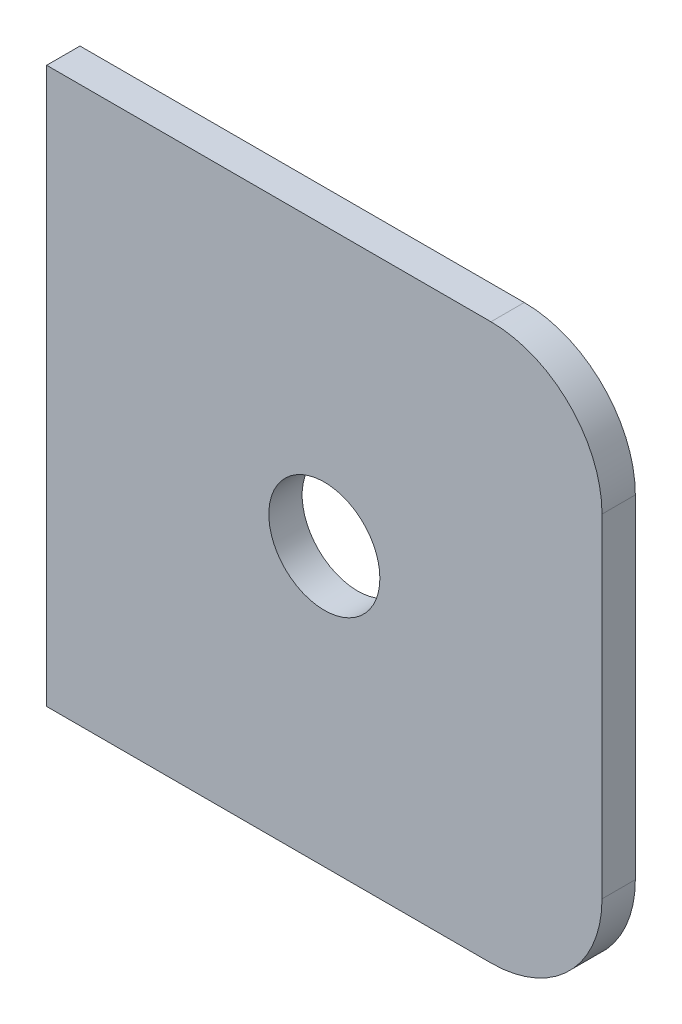
ISO-10303-21;
HEADER;
FILE_DESCRIPTION(('STEP AP214'),'2;1');
FILE_NAME('part.step','',(''),(''),'','','');
FILE_SCHEMA(('AUTOMOTIVE_DESIGN { 1 0 10303 214 1 1 1 1 }'));
ENDSEC;
DATA;
#1=APPLICATION_CONTEXT('core data for automotive mechanical design processes');
#2=APPLICATION_PROTOCOL_DEFINITION('international standard','automotive_design',2000,#1);
#3=PRODUCT_CONTEXT('',#1,'mechanical');
#4=PRODUCT('Part','Part','',(#3));
#5=PRODUCT_RELATED_PRODUCT_CATEGORY('part','',(#4));
#6=PRODUCT_DEFINITION_FORMATION('','',#4);
#7=PRODUCT_DEFINITION_CONTEXT('part definition',#1,'design');
#8=PRODUCT_DEFINITION('design','',#6,#7);
#9=PRODUCT_DEFINITION_SHAPE('','',#8);
#10=(LENGTH_UNIT() NAMED_UNIT(*) SI_UNIT(.MILLI.,.METRE.));
#11=(NAMED_UNIT(*) PLANE_ANGLE_UNIT() SI_UNIT($,.RADIAN.));
#12=(NAMED_UNIT(*) SI_UNIT($,.STERADIAN.) SOLID_ANGLE_UNIT());
#13=UNCERTAINTY_MEASURE_WITH_UNIT(LENGTH_MEASURE(1.E-05),#10,'distance_accuracy_value','');
#14=(GEOMETRIC_REPRESENTATION_CONTEXT(3) GLOBAL_UNCERTAINTY_ASSIGNED_CONTEXT((#13)) GLOBAL_UNIT_ASSIGNED_CONTEXT((#10,
#11,#12)) REPRESENTATION_CONTEXT('',''));
#15=CARTESIAN_POINT('',(0.,0.,0.));
#16=DIRECTION('',(0.,0.,1.));
#17=DIRECTION('',(1.,0.,0.));
#18=AXIS2_PLACEMENT_3D('',#15,#16,#17);
#19=CARTESIAN_POINT('',(15.9883720930233,-13.6918604651163,3.));
#20=DIRECTION('',(0.,0.,1.));
#21=DIRECTION('',(1.,0.,0.));
#22=AXIS2_PLACEMENT_3D('',#19,#20,#21);
#23=PLANE('',#22);
#24=DIRECTION('',(0.,-1.,0.));
#25=VECTOR('',#24,1.);
#26=CARTESIAN_POINT('',(-24.0116279069767,26.3081395348837,3.));
#27=LINE('',#26,#25);
#28=CARTESIAN_POINT('',(-24.0116279069767,26.3081395348837,3.));
#29=VERTEX_POINT('',#28);
#30=CARTESIAN_POINT('',(-24.0116279069767,-23.6918604651163,3.));
#31=VERTEX_POINT('',#30);
#32=EDGE_CURVE('E133',#29,#31,#27,.T.);
#33=ORIENTED_EDGE('',*,*,#32,.T.);
#34=DIRECTION('',(1.,0.,0.));
#35=VECTOR('',#34,1.);
#36=CARTESIAN_POINT('',(-24.0116279069767,-23.6918604651163,3.));
#37=LINE('',#36,#35);
#38=CARTESIAN_POINT('',(15.9883720930233,-23.6918604651163,3.));
#39=VERTEX_POINT('',#38);
#40=EDGE_CURVE('E91',#31,#39,#37,.T.);
#41=ORIENTED_EDGE('',*,*,#40,.T.);
#42=CARTESIAN_POINT('',(15.9883720930233,-13.6918604651163,3.));
#43=DIRECTION('',(0.,0.,1.));
#44=DIRECTION('',(1.,0.,0.));
#45=AXIS2_PLACEMENT_3D('',#42,#43,#44);
#46=CIRCLE('',#45,10.);
#47=CARTESIAN_POINT('',(25.9883720930233,-13.6918604651163,3.));
#48=VERTEX_POINT('',#47);
#49=EDGE_CURVE('E104',#39,#48,#46,.T.);
#50=ORIENTED_EDGE('',*,*,#49,.T.);
#51=DIRECTION('',(0.,1.,0.));
#52=VECTOR('',#51,1.);
#53=CARTESIAN_POINT('',(25.9883720930233,16.3081395348837,3.));
#54=LINE('',#53,#52);
#55=CARTESIAN_POINT('',(25.9883720930233,16.3081395348837,3.));
#56=VERTEX_POINT('',#55);
#57=EDGE_CURVE('E98',#48,#56,#54,.T.);
#58=ORIENTED_EDGE('',*,*,#57,.T.);
#59=CARTESIAN_POINT('',(15.9883720930233,16.3081395348837,3.));
#60=DIRECTION('',(0.,0.,1.));
#61=DIRECTION('',(1.,0.,0.));
#62=AXIS2_PLACEMENT_3D('',#59,#60,#61);
#63=CIRCLE('',#62,10.);
#64=CARTESIAN_POINT('',(15.9883720930233,26.3081395348837,3.));
#65=VERTEX_POINT('',#64);
#66=EDGE_CURVE('E102',#56,#65,#63,.T.);
#67=ORIENTED_EDGE('',*,*,#66,.T.);
#68=DIRECTION('',(-1.,0.,0.));
#69=VECTOR('',#68,1.);
#70=CARTESIAN_POINT('',(-24.0116279069767,26.3081395348837,3.));
#71=LINE('',#70,#69);
#72=EDGE_CURVE('E54',#65,#29,#71,.T.);
#73=ORIENTED_EDGE('',*,*,#72,.T.);
#74=EDGE_LOOP('',(#33,#41,#50,#58,#67,#73));
#75=FACE_BOUND('',#74,.T.);
#76=CARTESIAN_POINT('',(0.988372093023281,1.30813953488371,3.));
#77=DIRECTION('',(0.,0.,1.));
#78=DIRECTION('',(1.,0.,0.));
#79=AXIS2_PLACEMENT_3D('',#76,#77,#78);
#80=CIRCLE('',#79,5.);
#81=CARTESIAN_POINT('',(5.98837209302328,1.30813953488371,3.));
#82=VERTEX_POINT('',#81);
#83=EDGE_CURVE('E126',#82,#82,#80,.T.);
#84=ORIENTED_EDGE('',*,*,#83,.F.);
#85=EDGE_LOOP('',(#84));
#86=FACE_BOUND('',#85,.T.);
#87=ADVANCED_FACE('F37',(#75,#86),#23,.T.);
#88=CARTESIAN_POINT('',(15.9883720930233,-13.6918604651163,0.));
#89=DIRECTION('',(0.,0.,1.));
#90=DIRECTION('',(1.,0.,0.));
#91=AXIS2_PLACEMENT_3D('',#88,#89,#90);
#92=PLANE('',#91);
#93=DIRECTION('',(0.,-1.,0.));
#94=VECTOR('',#93,1.);
#95=CARTESIAN_POINT('',(-24.0116279069767,26.3081395348837,0.));
#96=LINE('',#95,#94);
#97=CARTESIAN_POINT('',(-24.0116279069767,26.3081395348837,0.));
#98=VERTEX_POINT('',#97);
#99=CARTESIAN_POINT('',(-24.0116279069767,-23.6918604651163,0.));
#100=VERTEX_POINT('',#99);
#101=EDGE_CURVE('E122',#98,#100,#96,.T.);
#102=ORIENTED_EDGE('',*,*,#101,.F.);
#103=DIRECTION('',(-1.,0.,0.));
#104=VECTOR('',#103,1.);
#105=CARTESIAN_POINT('',(-24.0116279069767,26.3081395348837,0.));
#106=LINE('',#105,#104);
#107=CARTESIAN_POINT('',(15.9883720930233,26.3081395348837,0.));
#108=VERTEX_POINT('',#107);
#109=EDGE_CURVE('E83',#108,#98,#106,.T.);
#110=ORIENTED_EDGE('',*,*,#109,.F.);
#111=CARTESIAN_POINT('',(15.9883720930233,16.3081395348837,0.));
#112=DIRECTION('',(0.,0.,1.));
#113=DIRECTION('',(1.,0.,0.));
#114=AXIS2_PLACEMENT_3D('',#111,#112,#113);
#115=CIRCLE('',#114,10.);
#116=CARTESIAN_POINT('',(25.9883720930233,16.3081395348837,0.));
#117=VERTEX_POINT('',#116);
#118=EDGE_CURVE('E77',#117,#108,#115,.T.);
#119=ORIENTED_EDGE('',*,*,#118,.F.);
#120=DIRECTION('',(0.,1.,0.));
#121=VECTOR('',#120,1.);
#122=CARTESIAN_POINT('',(25.9883720930233,16.3081395348837,0.));
#123=LINE('',#122,#121);
#124=CARTESIAN_POINT('',(25.9883720930233,-13.6918604651163,0.));
#125=VERTEX_POINT('',#124);
#126=EDGE_CURVE('E112',#125,#117,#123,.T.);
#127=ORIENTED_EDGE('',*,*,#126,.F.);
#128=CARTESIAN_POINT('',(15.9883720930233,-13.6918604651163,0.));
#129=DIRECTION('',(0.,0.,1.));
#130=DIRECTION('',(1.,0.,0.));
#131=AXIS2_PLACEMENT_3D('',#128,#129,#130);
#132=CIRCLE('',#131,10.);
#133=CARTESIAN_POINT('',(15.9883720930233,-23.6918604651163,0.));
#134=VERTEX_POINT('',#133);
#135=EDGE_CURVE('E128',#134,#125,#132,.T.);
#136=ORIENTED_EDGE('',*,*,#135,.F.);
#137=DIRECTION('',(1.,0.,0.));
#138=VECTOR('',#137,1.);
#139=CARTESIAN_POINT('',(-24.0116279069767,-23.6918604651163,0.));
#140=LINE('',#139,#138);
#141=EDGE_CURVE('E125',#100,#134,#140,.T.);
#142=ORIENTED_EDGE('',*,*,#141,.F.);
#143=EDGE_LOOP('',(#102,#110,#119,#127,#136,#142));
#144=FACE_BOUND('',#143,.T.);
#145=CARTESIAN_POINT('',(0.988372093023281,1.30813953488371,0.));
#146=DIRECTION('',(0.,0.,1.));
#147=DIRECTION('',(1.,0.,0.));
#148=AXIS2_PLACEMENT_3D('',#145,#146,#147);
#149=CIRCLE('',#148,5.);
#150=CARTESIAN_POINT('',(5.98837209302328,1.30813953488371,0.));
#151=VERTEX_POINT('',#150);
#152=EDGE_CURVE('E226',#151,#151,#149,.T.);
#153=ORIENTED_EDGE('',*,*,#152,.T.);
#154=EDGE_LOOP('',(#153));
#155=FACE_BOUND('',#154,.T.);
#156=ADVANCED_FACE('F142',(#144,#155),#92,.F.);
#157=CARTESIAN_POINT('',(-24.0116279069767,26.3081395348837,3.));
#158=DIRECTION('',(1.,0.,0.));
#159=DIRECTION('',(0.,1.,0.));
#160=AXIS2_PLACEMENT_3D('',#157,#158,#159);
#161=PLANE('',#160);
#162=ORIENTED_EDGE('',*,*,#101,.T.);
#163=DIRECTION('',(0.,0.,-1.));
#164=VECTOR('',#163,1.);
#165=CARTESIAN_POINT('',(-24.0116279069767,-23.6918604651163,3.));
#166=LINE('',#165,#164);
#167=EDGE_CURVE('E11',#31,#100,#166,.T.);
#168=ORIENTED_EDGE('',*,*,#167,.F.);
#169=ORIENTED_EDGE('',*,*,#32,.F.);
#170=DIRECTION('',(0.,0.,-1.));
#171=VECTOR('',#170,1.);
#172=CARTESIAN_POINT('',(-24.0116279069767,26.3081395348837,3.));
#173=LINE('',#172,#171);
#174=EDGE_CURVE('E118',#29,#98,#173,.T.);
#175=ORIENTED_EDGE('',*,*,#174,.T.);
#176=EDGE_LOOP('',(#162,#168,#169,#175));
#177=FACE_BOUND('',#176,.T.);
#178=ADVANCED_FACE('F39',(#177),#161,.F.);
#179=CARTESIAN_POINT('',(-24.0116279069767,-23.6918604651163,3.));
#180=DIRECTION('',(0.,1.,0.));
#181=DIRECTION('',(0.,0.,1.));
#182=AXIS2_PLACEMENT_3D('',#179,#180,#181);
#183=PLANE('',#182);
#184=ORIENTED_EDGE('',*,*,#141,.T.);
#185=DIRECTION('',(0.,0.,-1.));
#186=VECTOR('',#185,1.);
#187=CARTESIAN_POINT('',(15.9883720930233,-23.6918604651163,3.));
#188=LINE('',#187,#186);
#189=EDGE_CURVE('E46',#39,#134,#188,.T.);
#190=ORIENTED_EDGE('',*,*,#189,.F.);
#191=ORIENTED_EDGE('',*,*,#40,.F.);
#192=ORIENTED_EDGE('',*,*,#167,.T.);
#193=EDGE_LOOP('',(#184,#190,#191,#192));
#194=FACE_BOUND('',#193,.T.);
#195=ADVANCED_FACE('F167',(#194),#183,.F.);
#196=CARTESIAN_POINT('',(15.9883720930233,-13.6918604651163,3.));
#197=DIRECTION('',(0.,0.,-1.));
#198=DIRECTION('',(-1.,0.,0.));
#199=AXIS2_PLACEMENT_3D('',#196,#197,#198);
#200=CYLINDRICAL_SURFACE('',#199,10.);
#201=ORIENTED_EDGE('',*,*,#135,.T.);
#202=DIRECTION('',(0.,0.,-1.));
#203=VECTOR('',#202,1.);
#204=CARTESIAN_POINT('',(25.9883720930233,-13.6918604651163,3.));
#205=LINE('',#204,#203);
#206=EDGE_CURVE('E113',#48,#125,#205,.T.);
#207=ORIENTED_EDGE('',*,*,#206,.F.);
#208=ORIENTED_EDGE('',*,*,#49,.F.);
#209=ORIENTED_EDGE('',*,*,#189,.T.);
#210=EDGE_LOOP('',(#201,#207,#208,#209));
#211=FACE_BOUND('',#210,.T.);
#212=ADVANCED_FACE('F139',(#211),#200,.T.);
#213=CARTESIAN_POINT('',(25.9883720930233,16.3081395348837,3.));
#214=DIRECTION('',(-1.,0.,0.));
#215=DIRECTION('',(0.,-1.,0.));
#216=AXIS2_PLACEMENT_3D('',#213,#214,#215);
#217=PLANE('',#216);
#218=ORIENTED_EDGE('',*,*,#126,.T.);
#219=DIRECTION('',(0.,0.,-1.));
#220=VECTOR('',#219,1.);
#221=CARTESIAN_POINT('',(25.9883720930233,16.3081395348837,3.));
#222=LINE('',#221,#220);
#223=EDGE_CURVE('E109',#56,#117,#222,.T.);
#224=ORIENTED_EDGE('',*,*,#223,.F.);
#225=ORIENTED_EDGE('',*,*,#57,.F.);
#226=ORIENTED_EDGE('',*,*,#206,.T.);
#227=EDGE_LOOP('',(#218,#224,#225,#226));
#228=FACE_BOUND('',#227,.T.);
#229=ADVANCED_FACE('F110',(#228),#217,.F.);
#230=CARTESIAN_POINT('',(15.9883720930233,16.3081395348837,3.));
#231=DIRECTION('',(0.,0.,-1.));
#232=DIRECTION('',(-1.,0.,0.));
#233=AXIS2_PLACEMENT_3D('',#230,#231,#232);
#234=CYLINDRICAL_SURFACE('',#233,10.);
#235=ORIENTED_EDGE('',*,*,#118,.T.);
#236=DIRECTION('',(0.,0.,-1.));
#237=VECTOR('',#236,1.);
#238=CARTESIAN_POINT('',(15.9883720930233,26.3081395348837,3.));
#239=LINE('',#238,#237);
#240=EDGE_CURVE('E114',#65,#108,#239,.T.);
#241=ORIENTED_EDGE('',*,*,#240,.F.);
#242=ORIENTED_EDGE('',*,*,#66,.F.);
#243=ORIENTED_EDGE('',*,*,#223,.T.);
#244=EDGE_LOOP('',(#235,#241,#242,#243));
#245=FACE_BOUND('',#244,.T.);
#246=ADVANCED_FACE('F116',(#245),#234,.T.);
#247=CARTESIAN_POINT('',(-24.0116279069767,26.3081395348837,3.));
#248=DIRECTION('',(0.,-1.,0.));
#249=DIRECTION('',(0.,0.,-1.));
#250=AXIS2_PLACEMENT_3D('',#247,#248,#249);
#251=PLANE('',#250);
#252=ORIENTED_EDGE('',*,*,#109,.T.);
#253=ORIENTED_EDGE('',*,*,#174,.F.);
#254=ORIENTED_EDGE('',*,*,#72,.F.);
#255=ORIENTED_EDGE('',*,*,#240,.T.);
#256=EDGE_LOOP('',(#252,#253,#254,#255));
#257=FACE_BOUND('',#256,.T.);
#258=ADVANCED_FACE('F147',(#257),#251,.F.);
#259=CARTESIAN_POINT('',(0.988372093023281,1.30813953488371,3.));
#260=DIRECTION('',(0.,0.,-1.));
#261=DIRECTION('',(-1.,0.,0.));
#262=AXIS2_PLACEMENT_3D('',#259,#260,#261);
#263=CYLINDRICAL_SURFACE('',#262,5.);
#264=ORIENTED_EDGE('',*,*,#83,.T.);
#265=EDGE_LOOP('',(#264));
#266=FACE_BOUND('',#265,.T.);
#267=ORIENTED_EDGE('',*,*,#152,.F.);
#268=EDGE_LOOP('',(#267));
#269=FACE_BOUND('',#268,.T.);
#270=ADVANCED_FACE('F149',(#266,#269),#263,.F.);
#271=CLOSED_SHELL('',(#87,#156,#178,#195,#212,#229,#246,#258,#270));
#272=MANIFOLD_SOLID_BREP('B2',#271);
#273=ADVANCED_BREP_SHAPE_REPRESENTATION('',(#18,#272),#14);
#274=SHAPE_DEFINITION_REPRESENTATION(#9,#273);
ENDSEC;
END-ISO-10303-21;
